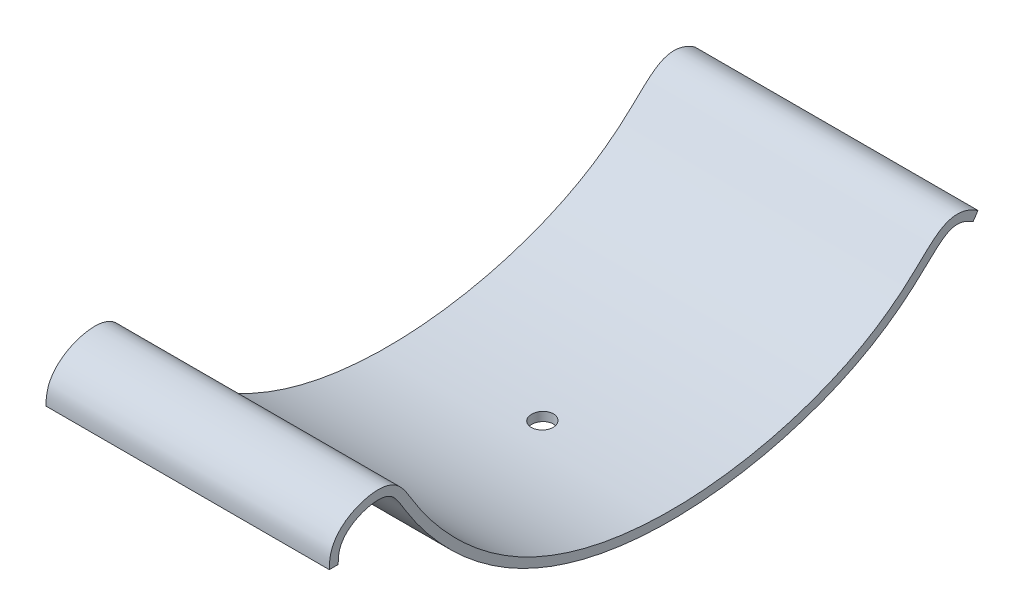
ISO-10303-21;
HEADER;
FILE_DESCRIPTION(('STEP AP214'),'2;1');
FILE_NAME('part.step','',(''),(''),'','','');
FILE_SCHEMA(('AUTOMOTIVE_DESIGN { 1 0 10303 214 1 1 1 1 }'));
ENDSEC;
DATA;
#1=APPLICATION_CONTEXT('core data for automotive mechanical design processes');
#2=APPLICATION_PROTOCOL_DEFINITION('international standard','automotive_design',2000,#1);
#3=PRODUCT_CONTEXT('',#1,'mechanical');
#4=PRODUCT('Part','Part','',(#3));
#5=PRODUCT_RELATED_PRODUCT_CATEGORY('part','',(#4));
#6=PRODUCT_DEFINITION_FORMATION('','',#4);
#7=PRODUCT_DEFINITION_CONTEXT('part definition',#1,'design');
#8=PRODUCT_DEFINITION('design','',#6,#7);
#9=PRODUCT_DEFINITION_SHAPE('','',#8);
#10=(LENGTH_UNIT() NAMED_UNIT(*) SI_UNIT(.MILLI.,.METRE.));
#11=(NAMED_UNIT(*) PLANE_ANGLE_UNIT() SI_UNIT($,.RADIAN.));
#12=(NAMED_UNIT(*) SI_UNIT($,.STERADIAN.) SOLID_ANGLE_UNIT());
#13=UNCERTAINTY_MEASURE_WITH_UNIT(LENGTH_MEASURE(1.E-05),#10,'distance_accuracy_value','');
#14=(GEOMETRIC_REPRESENTATION_CONTEXT(3) GLOBAL_UNCERTAINTY_ASSIGNED_CONTEXT((#13)) GLOBAL_UNIT_ASSIGNED_CONTEXT((#10,
#11,#12)) REPRESENTATION_CONTEXT('',''));
#15=CARTESIAN_POINT('',(0.,0.,0.));
#16=DIRECTION('',(0.,0.,1.));
#17=DIRECTION('',(1.,0.,0.));
#18=AXIS2_PLACEMENT_3D('',#15,#16,#17);
#19=CARTESIAN_POINT('',(-8.12799999999991,-0.834595862935661,-16.8716748113434));
#20=CARTESIAN_POINT('',(-8.12799999999991,-0.758500589889466,-16.7580385047832));
#21=CARTESIAN_POINT('',(-8.12799999999991,-0.614751083082066,-16.5100905502787));
#22=CARTESIAN_POINT('',(-8.12799999999991,-0.442822428426415,-16.0655195392353));
#23=CARTESIAN_POINT('',(-8.12799999999991,-0.390397203187676,-15.5351535365327));
#24=CARTESIAN_POINT('',(-8.12799999999991,-0.554381657714154,-14.9803618686963));
#25=CARTESIAN_POINT('',(-8.12799999999991,-0.959441699435293,-14.3394333059973));
#26=CARTESIAN_POINT('',(-8.12799999999991,-1.67781893043695,-13.5970485310267));
#27=CARTESIAN_POINT('',(-8.12799999999991,-2.69571342949548,-12.5111875307591));
#28=CARTESIAN_POINT('',(-8.12799999999991,-3.7571934363767,-11.0885539642779));
#29=CARTESIAN_POINT('',(-8.12799999999991,-5.10380533286114,-8.69093617801675));
#30=CARTESIAN_POINT('',(-8.12799999999991,-6.44967803214258,-4.84446903375801));
#31=CARTESIAN_POINT('',(-8.12799999999991,-7.09712226295534,0.254465303981544));
#32=CARTESIAN_POINT('',(-8.12799999999991,-6.69212017931453,4.91482262236442));
#33=CARTESIAN_POINT('',(-8.12799999999991,-5.44716621101371,8.6493730974796));
#34=CARTESIAN_POINT('',(-8.12799999999991,-3.73997250168423,11.4025743436018));
#35=CARTESIAN_POINT('',(-8.12799999999991,-1.95910220557749,13.3454415391405));
#36=CARTESIAN_POINT('',(-8.12799999999991,-0.394174789257407,14.6617063996737));
#37=CARTESIAN_POINT('',(-8.12799999999991,0.82661653105176,15.4883777575322));
#38=CARTESIAN_POINT('',(-8.12799999999991,1.73488163903246,15.998453090879));
#39=CARTESIAN_POINT('',(-8.12799999999991,2.45716276657815,16.6950338077725));
#40=CARTESIAN_POINT('',(-8.12799999999991,2.56249825223986,17.7825668359178));
#41=CARTESIAN_POINT('',(-8.12799999999991,2.23981894539993,18.8546539022874));
#42=CARTESIAN_POINT('',(-8.12799999999991,1.76507882125421,19.6532639018205));
#43=CARTESIAN_POINT('',(-8.12799999999991,1.1225727640134,20.153134502105));
#44=CARTESIAN_POINT('',(-8.12799999999991,0.474617449153558,20.3339100819827));
#45=CARTESIAN_POINT('',(-8.12799999999991,0.104773323174379,20.3536529968454));
#46=CARTESIAN_POINT('',(-8.12799999999991,-0.0750645134373062,20.3536529968454));
#47=B_SPLINE_CURVE_WITH_KNOTS('',3,(#19,#20,#21,#22,#23,#24,#25,#26,#27,#28,#29,#30,#31,#32,#33,
#34,#35,#36,#37,#38,#39,#40,#41,#42,#43,#44,#45,#46),.UNSPECIFIED.,.F.,.F.,(4,1,1,1,1,1,1,1,1,1,
1,1,1,1,1,1,1,1,1,1,1,1,1,1,1,4),(0.,0.0078125,0.015625,0.03125,0.046875,0.0625,0.09375,0.125,
0.15625,0.1875,0.25,0.3125,0.375,0.4375,0.5,0.5625,0.625,0.6875,0.75,0.8125,0.875,0.90625,
0.9375,0.96875,0.984375,1.),.UNSPECIFIED.);
#48=DIRECTION('',(1.,0.,0.));
#49=VECTOR('',#48,1.);
#50=SURFACE_OF_LINEAR_EXTRUSION('',#47,#49);
#51=CARTESIAN_POINT('',(0.,-6.92847417412679,0.635000000000052));
#52=CARTESIAN_POINT('',(0.0356673955473135,-6.92847424202453,0.634998423076402));
#53=CARTESIAN_POINT('',(0.0713604720865015,-6.92845990671786,0.631984826605673));
#54=CARTESIAN_POINT('',(0.141763460239447,-6.92839594212717,0.620004867662485));
#55=CARTESIAN_POINT('',(0.176472144631064,-6.92834627064212,0.611031388318102));
#56=CARTESIAN_POINT('',(0.243872049270245,-6.92819224238232,0.587388721582166));
#57=CARTESIAN_POINT('',(0.276564477052722,-6.92808791870129,0.572722982434909));
#58=CARTESIAN_POINT('',(0.339022647828301,-6.92779573587765,0.538111159860263));
#59=CARTESIAN_POINT('',(0.368788336539328,-6.92760787518604,0.518164978522118));
#60=CARTESIAN_POINT('',(0.424546285111496,-6.92711459438814,0.473560879821487));
#61=CARTESIAN_POINT('',(0.450538829234214,-6.92680918314421,0.448903317730044));
#62=CARTESIAN_POINT('',(0.498015900252995,-6.92604704787024,0.395575175288319));
#63=CARTESIAN_POINT('',(0.51950025788984,-6.92559031816063,0.36690444433153));
#64=CARTESIAN_POINT('',(0.557347808584863,-6.92449797108329,0.306369825006207));
#65=CARTESIAN_POINT('',(0.573711663882018,-6.92386237686846,0.274506350262276));
#66=CARTESIAN_POINT('',(0.600858658959247,-6.92239597643936,0.208489050026963));
#67=CARTESIAN_POINT('',(0.611641812346982,-6.92156517070108,0.174335230120456));
#68=CARTESIAN_POINT('',(0.627324297263235,-6.91970811583442,0.104704156437458));
#69=CARTESIAN_POINT('',(0.632223054050812,-6.91868184762616,0.0692267737347756));
#70=CARTESIAN_POINT('',(0.635998583786188,-6.91645292411601,-0.00204137857994751));
#71=CARTESIAN_POINT('',(0.634875346032915,-6.91525026850068,-0.0378321487487643));
#72=CARTESIAN_POINT('',(0.626638850884173,-6.91270560516999,-0.108735008090587));
#73=CARTESIAN_POINT('',(0.619521893871454,-6.91136351183547,-0.143846664384965));
#74=CARTESIAN_POINT('',(0.599496791261863,-6.90859580131977,-0.212374398013284));
#75=CARTESIAN_POINT('',(0.586588604606498,-6.90717018354648,-0.245790463324002));
#76=CARTESIAN_POINT('',(0.555334161688508,-6.904303148228,-0.310008418186525));
#77=CARTESIAN_POINT('',(0.536983389762097,-6.90286171852393,-0.340808109550972));
#78=CARTESIAN_POINT('',(0.495367209555368,-6.90004190433413,-0.398889288098149));
#79=CARTESIAN_POINT('',(0.472101792041757,-6.89866351996684,-0.426170768670957));
#80=CARTESIAN_POINT('',(0.421311155199238,-6.89604967252442,-0.476443936349189));
#81=CARTESIAN_POINT('',(0.393785424767783,-6.8948142266285,-0.499435108022604));
#82=CARTESIAN_POINT('',(0.33525570499369,-6.89256214336128,-0.54046826783324));
#83=CARTESIAN_POINT('',(0.304251735754644,-6.89154550472542,-0.558510284573607));
#84=CARTESIAN_POINT('',(0.239681090473667,-6.88979669326471,-0.589112075821943));
#85=CARTESIAN_POINT('',(0.206117255471266,-6.88906421041542,-0.601677826995722));
#86=CARTESIAN_POINT('',(0.137350924811729,-6.88792988320232,-0.620995313763373));
#87=CARTESIAN_POINT('',(0.102148445470637,-6.8875280355471,-0.627747107233996));
#88=CARTESIAN_POINT('',(0.0311620047851718,-6.88708191632692,-0.635236790847839));
#89=CARTESIAN_POINT('',(-0.00462098098345198,-6.88703709680061,-0.635983896909881));
#90=CARTESIAN_POINT('',(-0.0758040227018798,-6.88730656392684,-0.631467016846669));
#91=CARTESIAN_POINT('',(-0.111204080377829,-6.88762084895994,-0.626203057829213));
#92=CARTESIAN_POINT('',(-0.180596624576626,-6.88858746026657,-0.609819736844883));
#93=CARTESIAN_POINT('',(-0.214589873864755,-6.88923960069302,-0.598703593985635));
#94=CARTESIAN_POINT('',(-0.280227200436439,-6.89083927621305,-0.570935693564246));
#95=CARTESIAN_POINT('',(-0.311871266378478,-6.89178681273264,-0.554283909278961));
#96=CARTESIAN_POINT('',(-0.371946165725079,-6.89391793922611,-0.515900056570388));
#97=CARTESIAN_POINT('',(-0.400373835650002,-6.89510175848685,-0.49416304993474));
#98=CARTESIAN_POINT('',(-0.453178595006078,-6.89763187084351,-0.446234870161672));
#99=CARTESIAN_POINT('',(-0.477555645586833,-6.89897816549755,-0.420043654307806));
#100=CARTESIAN_POINT('',(-0.521606594144856,-6.90175632460805,-0.363904572105874));
#101=CARTESIAN_POINT('',(-0.541273149844062,-6.90318831835806,-0.33395095062288));
#102=CARTESIAN_POINT('',(-0.575298349175829,-6.90605719571663,-0.27116729201783));
#103=CARTESIAN_POINT('',(-0.58965697224162,-6.90749407934412,-0.238337243751027));
#104=CARTESIAN_POINT('',(-0.612667801579727,-6.91030204438403,-0.170704488766405));
#105=CARTESIAN_POINT('',(-0.621315740736801,-6.911673075883,-0.135900327997958));
#106=CARTESIAN_POINT('',(-0.632640699295836,-6.91428882480283,-0.0653290100735757));
#107=CARTESIAN_POINT('',(-0.635317720547508,-6.91553354226283,-0.029561853215968));
#108=CARTESIAN_POINT('',(-0.634622308853049,-6.91785344018537,0.0419037318404204));
#109=CARTESIAN_POINT('',(-0.631252489652438,-6.91892869368016,0.0776021830604811));
#110=CARTESIAN_POINT('',(-0.618561484296612,-6.92088635677184,0.147930587333971));
#111=CARTESIAN_POINT('',(-0.609240314536405,-6.92176876689997,0.182560543330657));
#112=CARTESIAN_POINT('',(-0.584919728294015,-6.92333542338773,0.249737725189134));
#113=CARTESIAN_POINT('',(-0.569925029917916,-6.92401983357185,0.282286655412163));
#114=CARTESIAN_POINT('',(-0.534681946390063,-6.925204158099,0.344405795392998));
#115=CARTESIAN_POINT('',(-0.514433778826222,-6.92570408008106,0.373976128447786));
#116=CARTESIAN_POINT('',(-0.469268019385189,-6.92654453647727,0.429286451509596));
#117=CARTESIAN_POINT('',(-0.444352397834166,-6.92688513793582,0.455028049588669));
#118=CARTESIAN_POINT('',(-0.390552566877031,-6.92744000994333,0.501963956599953));
#119=CARTESIAN_POINT('',(-0.361668433678539,-6.92765428291775,0.523158352832401));
#120=CARTESIAN_POINT('',(-0.300736863990924,-6.92799107246805,0.560409468213653));
#121=CARTESIAN_POINT('',(-0.268687494004858,-6.9281135325624,0.576463021342038));
#122=CARTESIAN_POINT('',(-0.202373577452853,-6.92829716661543,0.602944233185814));
#123=CARTESIAN_POINT('',(-0.168111721731151,-6.92835841358136,0.613378586899887));
#124=CARTESIAN_POINT('',(-0.111361415648438,-6.92842605207504,0.625560357252526));
#125=CARTESIAN_POINT('',(-0.0892407896247952,-6.92844437843214,0.629095784370743));
#126=CARTESIAN_POINT('',(-0.0447501460820092,-6.92846841815675,0.633816100579437));
#127=CARTESIAN_POINT('',(-0.0223801285414712,-6.92847413152316,0.635000989468261));
#128=CARTESIAN_POINT('',(0.,-6.92847417412679,0.635000000000052));
#129=B_SPLINE_CURVE_WITH_KNOTS('',3,(#51,#52,#53,#54,#55,#56,#57,#58,#59,#60,#61,#62,#63,#64,
#65,#66,#67,#68,#69,#70,#71,#72,#73,#74,#75,#76,#77,#78,#79,#80,#81,#82,#83,#84,#85,#86,#87,#88,
#89,#90,#91,#92,#93,#94,#95,#96,#97,#98,#99,#100,#101,#102,#103,#104,#105,#106,#107,#108,#109,
#110,#111,#112,#113,#114,#115,#116,#117,#118,#119,#120,#121,#122,#123,#124,#125,#126,#127,#128),
.UNSPECIFIED.,.T.,.F.,(4,2,2,2,2,2,2,2,2,2,2,2,2,2,2,2,2,2,2,2,2,2,2,2,2,2,2,2,2,2,2,2,2,2,2,2,
2,2,4),(0.,0.106920525513031,0.213968958087242,0.320952644060378,0.427938313880106,
0.534915919414027,0.64189754068855,0.748865320213855,0.8558328389139,0.96281080449899,
1.0697889601838,1.17683319646638,1.28387819168007,1.39101225080462,1.49814651120693,
1.6052936343021,1.71244013813813,1.81946941019151,1.92649761677819,2.03336152638932,
2.14022495408355,2.24702966079371,2.35383488310789,2.46074425669873,2.56765465562219,
2.6747306275297,2.78180701432259,2.88896332005867,2.99611959259912,3.10322955802008,
3.21033922837166,3.31736002140076,3.42437638255562,3.53134766904865,3.63831690165123,
3.74535188579428,3.85225905929953,3.91934819947078,3.9864373453976),.UNSPECIFIED.);
#130=CARTESIAN_POINT('',(0.,-6.92847417412679,0.635000000000052));
#131=VERTEX_POINT('',#130);
#132=EDGE_CURVE('E121',#131,#131,#129,.T.);
#133=ORIENTED_EDGE('',*,*,#132,.F.);
#134=EDGE_LOOP('',(#133));
#135=FACE_BOUND('',#134,.T.);
#136=DIRECTION('',(1.,0.,0.));
#137=VECTOR('',#136,1.);
#138=CARTESIAN_POINT('',(-8.12799999999991,-0.0750645134373062,20.3536529968454));
#139=LINE('',#138,#137);
#140=CARTESIAN_POINT('',(-8.12799999999991,-0.0750645134373062,20.3536529968454));
#141=VERTEX_POINT('',#140);
#142=CARTESIAN_POINT('',(8.12799999999991,-0.0750645134373062,20.3536529968454));
#143=VERTEX_POINT('',#142);
#144=EDGE_CURVE('E100',#141,#143,#139,.T.);
#145=ORIENTED_EDGE('',*,*,#144,.T.);
#146=CARTESIAN_POINT('',(8.12799999999991,-0.834595862935661,-16.8716748113434));
#147=CARTESIAN_POINT('',(8.12799999999991,-0.758500589889466,-16.7580385047832));
#148=CARTESIAN_POINT('',(8.12799999999991,-0.614751083082066,-16.5100905502787));
#149=CARTESIAN_POINT('',(8.12799999999991,-0.442822428426415,-16.0655195392353));
#150=CARTESIAN_POINT('',(8.12799999999991,-0.390397203187676,-15.5351535365327));
#151=CARTESIAN_POINT('',(8.12799999999991,-0.554381657714154,-14.9803618686963));
#152=CARTESIAN_POINT('',(8.12799999999991,-0.959441699435293,-14.3394333059973));
#153=CARTESIAN_POINT('',(8.12799999999991,-1.67781893043695,-13.5970485310267));
#154=CARTESIAN_POINT('',(8.12799999999991,-2.69571342949548,-12.5111875307591));
#155=CARTESIAN_POINT('',(8.12799999999991,-3.7571934363767,-11.0885539642779));
#156=CARTESIAN_POINT('',(8.12799999999991,-5.10380533286114,-8.69093617801675));
#157=CARTESIAN_POINT('',(8.12799999999991,-6.44967803214258,-4.84446903375801));
#158=CARTESIAN_POINT('',(8.12799999999991,-7.09712226295534,0.254465303981544));
#159=CARTESIAN_POINT('',(8.12799999999991,-6.69212017931453,4.91482262236442));
#160=CARTESIAN_POINT('',(8.12799999999991,-5.44716621101371,8.6493730974796));
#161=CARTESIAN_POINT('',(8.12799999999991,-3.73997250168423,11.4025743436018));
#162=CARTESIAN_POINT('',(8.12799999999991,-1.95910220557749,13.3454415391405));
#163=CARTESIAN_POINT('',(8.12799999999991,-0.394174789257407,14.6617063996737));
#164=CARTESIAN_POINT('',(8.12799999999991,0.82661653105176,15.4883777575322));
#165=CARTESIAN_POINT('',(8.12799999999991,1.73488163903246,15.998453090879));
#166=CARTESIAN_POINT('',(8.12799999999991,2.45716276657815,16.6950338077725));
#167=CARTESIAN_POINT('',(8.12799999999991,2.56249825223986,17.7825668359178));
#168=CARTESIAN_POINT('',(8.12799999999991,2.23981894539993,18.8546539022874));
#169=CARTESIAN_POINT('',(8.12799999999991,1.76507882125421,19.6532639018205));
#170=CARTESIAN_POINT('',(8.12799999999991,1.1225727640134,20.153134502105));
#171=CARTESIAN_POINT('',(8.12799999999991,0.474617449153558,20.3339100819827));
#172=CARTESIAN_POINT('',(8.12799999999991,0.104773323174379,20.3536529968454));
#173=CARTESIAN_POINT('',(8.12799999999991,-0.0750645134373062,20.3536529968454));
#174=B_SPLINE_CURVE_WITH_KNOTS('',3,(#146,#147,#148,#149,#150,#151,#152,#153,#154,#155,#156,
#157,#158,#159,#160,#161,#162,#163,#164,#165,#166,#167,#168,#169,#170,#171,#172,#173),
.UNSPECIFIED.,.F.,.F.,(4,1,1,1,1,1,1,1,1,1,1,1,1,1,1,1,1,1,1,1,1,1,1,1,1,4),(0.,0.0078125,
0.015625,0.03125,0.046875,0.0625,0.09375,0.125,0.15625,0.1875,0.25,0.3125,0.375,0.4375,0.5,
0.5625,0.625,0.6875,0.75,0.8125,0.875,0.90625,0.9375,0.96875,0.984375,1.),.UNSPECIFIED.);
#175=CARTESIAN_POINT('',(8.12799999999991,-0.834595862935661,-16.8716748113434));
#176=VERTEX_POINT('',#175);
#177=EDGE_CURVE('E103',#176,#143,#174,.T.);
#178=ORIENTED_EDGE('',*,*,#177,.F.);
#179=DIRECTION('',(1.,0.,0.));
#180=VECTOR('',#179,1.);
#181=CARTESIAN_POINT('',(-8.12799999999991,-0.834595862935661,-16.8716748113434));
#182=LINE('',#181,#180);
#183=CARTESIAN_POINT('',(-8.12799999999991,-0.834595862935661,-16.8716748113434));
#184=VERTEX_POINT('',#183);
#185=EDGE_CURVE('E13',#184,#176,#182,.T.);
#186=ORIENTED_EDGE('',*,*,#185,.F.);
#187=EDGE_CURVE('E104',#184,#141,#47,.T.);
#188=ORIENTED_EDGE('',*,*,#187,.T.);
#189=EDGE_LOOP('',(#145,#178,#186,#188));
#190=FACE_BOUND('',#189,.T.);
#191=ADVANCED_FACE('F55',(#135,#190),#50,.T.);
#192=CARTESIAN_POINT('',(-8.12799999999991,-1.25669751245872,-16.5890191949657));
#193=DIRECTION('',(0.,-0.556408693657023,-0.830908758903699));
#194=DIRECTION('',(0.,0.830908758903699,-0.556408693657023));
#195=AXIS2_PLACEMENT_3D('',#192,#193,#194);
#196=PLANE('',#195);
#197=ORIENTED_EDGE('',*,*,#185,.T.);
#198=DIRECTION('',(0.,0.830908758903699,-0.556408693657023));
#199=VECTOR('',#198,1.);
#200=CARTESIAN_POINT('',(8.12799999999991,-1.25669751245872,-16.5890191949657));
#201=LINE('',#200,#199);
#202=CARTESIAN_POINT('',(8.12799999999991,-1.25669751245872,-16.5890191949657));
#203=VERTEX_POINT('',#202);
#204=EDGE_CURVE('E120',#203,#176,#201,.T.);
#205=ORIENTED_EDGE('',*,*,#204,.F.);
#206=DIRECTION('',(1.,0.,0.));
#207=VECTOR('',#206,1.);
#208=CARTESIAN_POINT('',(-8.12799999999991,-1.25669751245872,-16.5890191949657));
#209=LINE('',#208,#207);
#210=CARTESIAN_POINT('',(-8.12799999999991,-1.25669751245872,-16.5890191949657));
#211=VERTEX_POINT('',#210);
#212=EDGE_CURVE('E70',#211,#203,#209,.T.);
#213=ORIENTED_EDGE('',*,*,#212,.F.);
#214=DIRECTION('',(0.,0.830908758903699,-0.556408693657023));
#215=VECTOR('',#214,1.);
#216=CARTESIAN_POINT('',(-8.12799999999991,-1.25669751245872,-16.5890191949657));
#217=LINE('',#216,#215);
#218=EDGE_CURVE('E109',#211,#184,#217,.T.);
#219=ORIENTED_EDGE('',*,*,#218,.T.);
#220=EDGE_LOOP('',(#197,#205,#213,#219));
#221=FACE_BOUND('',#220,.T.);
#222=ADVANCED_FACE('F161',(#221),#196,.T.);
#223=CARTESIAN_POINT('',(-8.12799999999991,-0.0750645134373062,19.8456529968454));
#224=CARTESIAN_POINT('',(-8.12799999999991,0.0778301212238652,19.8456529968454));
#225=CARTESIAN_POINT('',(-8.12799999999991,0.405127673048122,19.8271729007947));
#226=CARTESIAN_POINT('',(-8.12799999999991,0.879281159174905,19.6902710720697));
#227=CARTESIAN_POINT('',(-8.12799999999991,1.36452645229534,19.3217353070485));
#228=CARTESIAN_POINT('',(-8.12799999999991,1.77061817082691,18.6507219164174));
#229=CARTESIAN_POINT('',(-8.12799999999991,2.04728251444508,17.717040392712));
#230=CARTESIAN_POINT('',(-8.12799999999991,1.94881535312708,16.9098241504062));
#231=CARTESIAN_POINT('',(-8.12799999999991,1.47983481819236,16.4534140475832));
#232=CARTESIAN_POINT('',(-8.12799999999991,0.560492217258735,15.917379729166));
#233=CARTESIAN_POINT('',(-8.12799999999991,-0.704210581464193,15.0665429553525));
#234=CARTESIAN_POINT('',(-8.12799999999991,-2.31158175132795,13.7127430471539));
#235=CARTESIAN_POINT('',(-8.12799999999991,-4.1469511972696,11.7117544687212));
#236=CARTESIAN_POINT('',(-8.12799999999991,-5.91305093659944,8.86359826457794));
#237=CARTESIAN_POINT('',(-8.12799999999991,-7.19542404272233,5.01215723980408));
#238=CARTESIAN_POINT('',(-8.12799999999991,-7.60864838300734,0.239508784072306));
#239=CARTESIAN_POINT('',(-8.12799999999991,-6.94733663098812,-4.95739009147722));
#240=CARTESIAN_POINT('',(-8.12799999999991,-5.30124674848653,-9.68400196845587));
#241=CARTESIAN_POINT('',(-8.12799999999991,-3.43669149050052,-12.4699982841006));
#242=CARTESIAN_POINT('',(-8.12799999999991,-2.03576103810665,-13.9551897291113));
#243=CARTESIAN_POINT('',(-8.12799999999991,-1.34265292722857,-14.6787920053277));
#244=CARTESIAN_POINT('',(-8.12799999999991,-1.01813501228076,-15.2043382552447));
#245=CARTESIAN_POINT('',(-8.12799999999991,-0.909597338166757,-15.583909243199));
#246=CARTESIAN_POINT('',(-8.12799999999991,-0.942711314550704,-15.9441425416236));
#247=CARTESIAN_POINT('',(-8.12799999999991,-1.07205244131536,-16.2849674733981));
#248=CARTESIAN_POINT('',(-8.12799999999991,-1.19364198072114,-16.4948556885084));
#249=CARTESIAN_POINT('',(-8.12799999999991,-1.25669751245872,-16.5890191949657));
#250=B_SPLINE_CURVE_WITH_KNOTS('',3,(#223,#224,#225,#226,#227,#228,#229,#230,#231,#232,#233,
#234,#235,#236,#237,#238,#239,#240,#241,#242,#243,#244,#245,#246,#247,#248,#249),.UNSPECIFIED.,
.F.,.F.,(4,1,1,1,1,1,1,1,1,1,1,1,1,1,1,1,1,1,1,1,1,1,1,1,4),(0.,0.015625,0.03125,0.0625,0.09375,
0.125,0.1875,0.25,0.3125,0.375,0.4375,0.5,0.5625,0.625,0.6875,0.75,0.8125,0.875,0.90625,0.9375,
0.953125,0.96875,0.984375,0.9921875,1.),.UNSPECIFIED.);
#251=DIRECTION('',(1.,0.,0.));
#252=VECTOR('',#251,1.);
#253=SURFACE_OF_LINEAR_EXTRUSION('',#250,#252);
#254=CARTESIAN_POINT('',(0.,-7.43649820657044,0.635000000000052));
#255=CARTESIAN_POINT('',(-0.0356674244547499,-7.43649827297458,0.634998422897253));
#256=CARTESIAN_POINT('',(-0.0713605370265964,-7.4364841514613,0.631984820983911));
#257=CARTESIAN_POINT('',(-0.141763602631587,-7.43642118579442,0.620004837991458));
#258=CARTESIAN_POINT('',(-0.176472328111993,-7.43637230011202,0.611031338149664));
#259=CARTESIAN_POINT('',(-0.243872303579989,-7.43622083611119,0.587388618196333));
#260=CARTESIAN_POINT('',(-0.276564761604613,-7.43611829029928,0.572722847767187));
#261=CARTESIAN_POINT('',(-0.339022993813796,-7.43583128193242,0.538110945105031));
#262=CARTESIAN_POINT('',(-0.368788713611524,-7.43564681785554,0.518164714772001));
#263=CARTESIAN_POINT('',(-0.424546783489221,-7.43516268494728,0.47356044325154));
#264=CARTESIAN_POINT('',(-0.450539410695511,-7.43486302458273,0.448902748420471));
#265=CARTESIAN_POINT('',(-0.498016640720292,-7.43411547695883,0.395574259748251));
#266=CARTESIAN_POINT('',(-0.519501073942303,-7.43366758412466,0.366903314997838));
#267=CARTESIAN_POINT('',(-0.557348842455697,-7.43259658313371,0.30636799552603));
#268=CARTESIAN_POINT('',(-0.573712815260752,-7.43197349680743,0.274504018999989));
#269=CARTESIAN_POINT('',(-0.600859918569205,-7.43053616568994,0.208485518094984));
#270=CARTESIAN_POINT('',(-0.611643062595811,-7.42972192136193,0.174330999266583));
#271=CARTESIAN_POINT('',(-0.627325287550811,-7.42790192652937,0.104698438869867));
#272=CARTESIAN_POINT('',(-0.632223814038021,-7.42689615799,0.069220272913848));
#273=CARTESIAN_POINT('',(-0.635998604160552,-7.42471172805539,-0.00204960983367481));
#274=CARTESIAN_POINT('',(-0.634874857975173,-7.4235330663782,-0.0378413271364008));
#275=CARTESIAN_POINT('',(-0.626637083141101,-7.42103913898535,-0.108745244107158));
#276=CARTESIAN_POINT('',(-0.619519505685858,-7.41972379274649,-0.143857028601064));
#277=CARTESIAN_POINT('',(-0.599493050842423,-7.41701116125498,-0.212385005733263));
#278=CARTESIAN_POINT('',(-0.586584133760928,-7.4156138754408,-0.245801186748299));
#279=CARTESIAN_POINT('',(-0.555328665133611,-7.4128037857387,-0.310018172868549));
#280=CARTESIAN_POINT('',(-0.536977776100706,-7.41139097034129,-0.340816866434142));
#281=CARTESIAN_POINT('',(-0.495361702494459,-7.40862706581108,-0.398896051483257));
#282=CARTESIAN_POINT('',(-0.472096509114394,-7.4072759767889,-0.4261765366618));
#283=CARTESIAN_POINT('',(-0.421306860530366,-7.40471384465228,-0.476447648213609));
#284=CARTESIAN_POINT('',(-0.393781912063342,-7.40350281778489,-0.499437777099378));
#285=CARTESIAN_POINT('',(-0.335254275527715,-7.40129521115228,-0.540469063527676));
#286=CARTESIAN_POINT('',(-0.3042516067488,-7.4002986301977,-0.55851024851834));
#287=CARTESIAN_POINT('',(-0.239682648793331,-7.39858425676519,-0.589111434380103));
#288=CARTESIAN_POINT('',(-0.206119088508979,-7.39786617235177,-0.60167717663046));
#289=CARTESIAN_POINT('',(-0.137353516615735,-7.39675413140777,-0.620994721112109));
#290=CARTESIAN_POINT('',(-0.10215152068901,-7.39636017177551,-0.627746578978519));
#291=CARTESIAN_POINT('',(-0.0311639954604372,-7.39592278295591,-0.635236784288622));
#292=CARTESIAN_POINT('',(0.0046205961838145,-7.39587883741053,-0.635983990105473));
#293=CARTESIAN_POINT('',(0.0758068618038791,-7.39614303318815,-0.63146676791305));
#294=CARTESIAN_POINT('',(0.111208537438593,-7.3964511729852,-0.62620236595831));
#295=CARTESIAN_POINT('',(0.180605045090388,-7.39739888945709,-0.609817388491417));
#296=CARTESIAN_POINT('',(0.214600610430282,-7.39803829095558,-0.598699908127951));
#297=CARTESIAN_POINT('',(0.280242329742719,-7.39960670321986,-0.570928436501706));
#298=CARTESIAN_POINT('',(0.311888472815823,-7.4005357153291,-0.554274419555792));
#299=CARTESIAN_POINT('',(0.371965909703713,-7.40262509949328,-0.515885935076823));
#300=CARTESIAN_POINT('',(0.400394161723405,-7.40378568763587,-0.494146719166258));
#301=CARTESIAN_POINT('',(0.453199621067018,-7.40626607835031,-0.446213665995757));
#302=CARTESIAN_POINT('',(0.477576790977147,-7.40758588239242,-0.420019787599281));
#303=CARTESIAN_POINT('',(0.521625976039104,-7.41030919979734,-0.363876782849274));
#304=CARTESIAN_POINT('',(0.541290933653865,-7.41171283483567,-0.333922124919537));
#305=CARTESIAN_POINT('',(0.575312782910401,-7.41452478951967,-0.271136665740483));
#306=CARTESIAN_POINT('',(0.589669655030436,-7.41593310918255,-0.23830585391398));
#307=CARTESIAN_POINT('',(0.612676512250511,-7.4186851086755,-0.170672989861908));
#308=CARTESIAN_POINT('',(0.621322400767943,-7.4200287414655,-0.135869542020544));
#309=CARTESIAN_POINT('',(0.632643604447019,-7.42259213738944,-0.0653001817583068));
#310=CARTESIAN_POINT('',(0.635318921007169,-7.42381190055239,-0.0295342695628766));
#311=CARTESIAN_POINT('',(0.634620594183734,-7.42608527066511,0.0419289450360111));
#312=CARTESIAN_POINT('',(0.631249465774206,-7.42713894649938,0.0776262697856581));
#313=CARTESIAN_POINT('',(0.618556285248541,-7.42905732089254,0.147952064082134));
#314=CARTESIAN_POINT('',(0.609234248349435,-7.42992201993465,0.182580536361882));
#315=CARTESIAN_POINT('',(0.584912049005864,-7.43145740550623,0.249755700035266));
#316=CARTESIAN_POINT('',(0.569916411897062,-7.43212824590964,0.282304026457581));
#317=CARTESIAN_POINT('',(0.534671666914588,-7.4332892396184,0.344421731870245));
#318=CARTESIAN_POINT('',(0.514422776175743,-7.43377940038983,0.373991233915415));
#319=CARTESIAN_POINT('',(0.469255391653302,-7.43460361058949,0.429300283706671));
#320=CARTESIAN_POINT('',(0.444338781788169,-7.43493772281045,0.45504136913091));
#321=CARTESIAN_POINT('',(0.39053707557711,-7.43548216617514,0.501976030291339));
#322=CARTESIAN_POINT('',(0.361652055481105,-7.43569249969678,0.523169693382681));
#323=CARTESIAN_POINT('',(0.300718860185758,-7.43602321265305,0.560419145275349));
#324=CARTESIAN_POINT('',(0.268668753481995,-7.43614353677034,0.576471771074116));
#325=CARTESIAN_POINT('',(0.202353530982242,-7.43632403877193,0.602950974431835));
#326=CARTESIAN_POINT('',(0.168091106625732,-7.43638428832611,0.613384249111013));
#327=CARTESIAN_POINT('',(0.11134368669841,-7.43645083869356,0.625563384490521));
#328=CARTESIAN_POINT('',(0.0892265341470029,-7.4364688759441,0.629097678652943));
#329=CARTESIAN_POINT('',(0.0447429579245494,-7.43649253905319,0.633816481214659));
#330=CARTESIAN_POINT('',(0.0223765342330278,-7.43649816491074,0.63500098942094));
#331=CARTESIAN_POINT('',(0.,-7.43649820657044,0.635000000000052));
#332=B_SPLINE_CURVE_WITH_KNOTS('',3,(#254,#255,#256,#257,#258,#259,#260,#261,#262,#263,#264,
#265,#266,#267,#268,#269,#270,#271,#272,#273,#274,#275,#276,#277,#278,#279,#280,#281,#282,#283,
#284,#285,#286,#287,#288,#289,#290,#291,#292,#293,#294,#295,#296,#297,#298,#299,#300,#301,#302,
#303,#304,#305,#306,#307,#308,#309,#310,#311,#312,#313,#314,#315,#316,#317,#318,#319,#320,#321,
#322,#323,#324,#325,#326,#327,#328,#329,#330,#331),.UNSPECIFIED.,.T.,.F.,(4,2,2,2,2,2,2,2,2,2,2,
2,2,2,2,2,2,2,2,2,2,2,2,2,2,2,2,2,2,2,2,2,2,2,2,2,2,2,4),(0.,0.106920624364053,
0.213969189626463,0.320952981369406,0.427938760789335,0.534916678331329,0.641898619619166,
0.748867236009135,0.855835593196482,0.962814028016204,1.06979263728888,1.17683463064959,
1.28387735767737,1.39100563275485,1.49813409981417,1.60527498122776,1.71241526839806,
1.81944293965011,1.92646958670512,2.03333831347816,2.14020657707985,2.24701838467745,
2.35383068776535,2.46074312934214,2.56765655825452,2.6747291256434,2.78180208681307,
2.88895177001503,2.99610142811895,3.10320652845025,3.21031135490484,3.31733093266904,
3.42434608765492,3.53131814339899,3.63828814404541,3.74532383168443,3.85223167075016,
3.91931004412172,3.98638842300311),.UNSPECIFIED.);
#333=CARTESIAN_POINT('',(0.,-7.43649820657044,0.635000000000052));
#334=VERTEX_POINT('',#333);
#335=EDGE_CURVE('E60',#334,#334,#332,.T.);
#336=ORIENTED_EDGE('',*,*,#335,.F.);
#337=EDGE_LOOP('',(#336));
#338=FACE_BOUND('',#337,.T.);
#339=ORIENTED_EDGE('',*,*,#212,.T.);
#340=CARTESIAN_POINT('',(8.12799999999991,-0.0750645134373062,19.8456529968454));
#341=CARTESIAN_POINT('',(8.12799999999991,0.0778301212238652,19.8456529968454));
#342=CARTESIAN_POINT('',(8.12799999999991,0.405127673048122,19.8271729007947));
#343=CARTESIAN_POINT('',(8.12799999999991,0.879281159174905,19.6902710720697));
#344=CARTESIAN_POINT('',(8.12799999999991,1.36452645229534,19.3217353070485));
#345=CARTESIAN_POINT('',(8.12799999999991,1.77061817082691,18.6507219164174));
#346=CARTESIAN_POINT('',(8.12799999999991,2.04728251444508,17.717040392712));
#347=CARTESIAN_POINT('',(8.12799999999991,1.94881535312708,16.9098241504062));
#348=CARTESIAN_POINT('',(8.12799999999991,1.47983481819236,16.4534140475832));
#349=CARTESIAN_POINT('',(8.12799999999991,0.560492217258735,15.917379729166));
#350=CARTESIAN_POINT('',(8.12799999999991,-0.704210581464193,15.0665429553525));
#351=CARTESIAN_POINT('',(8.12799999999991,-2.31158175132795,13.7127430471539));
#352=CARTESIAN_POINT('',(8.12799999999991,-4.1469511972696,11.7117544687212));
#353=CARTESIAN_POINT('',(8.12799999999991,-5.91305093659944,8.86359826457794));
#354=CARTESIAN_POINT('',(8.12799999999991,-7.19542404272233,5.01215723980408));
#355=CARTESIAN_POINT('',(8.12799999999991,-7.60864838300734,0.239508784072306));
#356=CARTESIAN_POINT('',(8.12799999999991,-6.94733663098812,-4.95739009147722));
#357=CARTESIAN_POINT('',(8.12799999999991,-5.30124674848653,-9.68400196845587));
#358=CARTESIAN_POINT('',(8.12799999999991,-3.43669149050052,-12.4699982841006));
#359=CARTESIAN_POINT('',(8.12799999999991,-2.03576103810665,-13.9551897291113));
#360=CARTESIAN_POINT('',(8.12799999999991,-1.34265292722857,-14.6787920053277));
#361=CARTESIAN_POINT('',(8.12799999999991,-1.01813501228076,-15.2043382552447));
#362=CARTESIAN_POINT('',(8.12799999999991,-0.909597338166757,-15.583909243199));
#363=CARTESIAN_POINT('',(8.12799999999991,-0.942711314550704,-15.9441425416236));
#364=CARTESIAN_POINT('',(8.12799999999991,-1.07205244131536,-16.2849674733981));
#365=CARTESIAN_POINT('',(8.12799999999991,-1.19364198072114,-16.4948556885084));
#366=CARTESIAN_POINT('',(8.12799999999991,-1.25669751245872,-16.5890191949657));
#367=B_SPLINE_CURVE_WITH_KNOTS('',3,(#340,#341,#342,#343,#344,#345,#346,#347,#348,#349,#350,
#351,#352,#353,#354,#355,#356,#357,#358,#359,#360,#361,#362,#363,#364,#365,#366),.UNSPECIFIED.,
.F.,.F.,(4,1,1,1,1,1,1,1,1,1,1,1,1,1,1,1,1,1,1,1,1,1,1,1,4),(0.,0.015625,0.03125,0.0625,0.09375,
0.125,0.1875,0.25,0.3125,0.375,0.4375,0.5,0.5625,0.625,0.6875,0.75,0.8125,0.875,0.90625,0.9375,
0.953125,0.96875,0.984375,0.9921875,1.),.UNSPECIFIED.);
#368=CARTESIAN_POINT('',(8.12799999999991,-0.0750645134373062,19.8456529968454));
#369=VERTEX_POINT('',#368);
#370=EDGE_CURVE('E116',#369,#203,#367,.T.);
#371=ORIENTED_EDGE('',*,*,#370,.F.);
#372=DIRECTION('',(1.,0.,0.));
#373=VECTOR('',#372,1.);
#374=CARTESIAN_POINT('',(-8.12799999999991,-0.0750645134373062,19.8456529968454));
#375=LINE('',#374,#373);
#376=CARTESIAN_POINT('',(-8.12799999999991,-0.0750645134373062,19.8456529968454));
#377=VERTEX_POINT('',#376);
#378=EDGE_CURVE('E108',#377,#369,#375,.T.);
#379=ORIENTED_EDGE('',*,*,#378,.F.);
#380=EDGE_CURVE('E149',#377,#211,#250,.T.);
#381=ORIENTED_EDGE('',*,*,#380,.T.);
#382=EDGE_LOOP('',(#339,#371,#379,#381));
#383=FACE_BOUND('',#382,.T.);
#384=ADVANCED_FACE('F157',(#338,#383),#253,.T.);
#385=CARTESIAN_POINT('',(-8.12799999999991,-0.0750645134373062,20.3536529968454));
#386=DIRECTION('',(0.,-1.,0.));
#387=DIRECTION('',(0.,0.,-1.));
#388=AXIS2_PLACEMENT_3D('',#385,#386,#387);
#389=PLANE('',#388);
#390=ORIENTED_EDGE('',*,*,#378,.T.);
#391=DIRECTION('',(0.,0.,-1.));
#392=VECTOR('',#391,1.);
#393=CARTESIAN_POINT('',(8.12799999999991,-0.0750645134373062,20.3536529968454));
#394=LINE('',#393,#392);
#395=EDGE_CURVE('E111',#143,#369,#394,.T.);
#396=ORIENTED_EDGE('',*,*,#395,.F.);
#397=ORIENTED_EDGE('',*,*,#144,.F.);
#398=DIRECTION('',(0.,0.,-1.));
#399=VECTOR('',#398,1.);
#400=CARTESIAN_POINT('',(-8.12799999999991,-0.0750645134373062,20.3536529968454));
#401=LINE('',#400,#399);
#402=EDGE_CURVE('E144',#141,#377,#401,.T.);
#403=ORIENTED_EDGE('',*,*,#402,.T.);
#404=EDGE_LOOP('',(#390,#396,#397,#403));
#405=FACE_BOUND('',#404,.T.);
#406=ADVANCED_FACE('F112',(#405),#389,.T.);
#407=CARTESIAN_POINT('',(-8.12799999999991,-3.72769307055476,11.2675186685046));
#408=DIRECTION('',(-1.,0.,0.));
#409=DIRECTION('',(0.,0.,1.));
#410=AXIS2_PLACEMENT_3D('',#407,#408,#409);
#411=PLANE('',#410);
#412=ORIENTED_EDGE('',*,*,#187,.F.);
#413=ORIENTED_EDGE('',*,*,#218,.F.);
#414=ORIENTED_EDGE('',*,*,#380,.F.);
#415=ORIENTED_EDGE('',*,*,#402,.F.);
#416=EDGE_LOOP('',(#412,#413,#414,#415));
#417=FACE_BOUND('',#416,.T.);
#418=ADVANCED_FACE('F165',(#417),#411,.T.);
#419=CARTESIAN_POINT('',(8.12799999999991,-3.72769307055476,11.2675186685046));
#420=DIRECTION('',(-1.,0.,0.));
#421=DIRECTION('',(0.,0.,1.));
#422=AXIS2_PLACEMENT_3D('',#419,#420,#421);
#423=PLANE('',#422);
#424=ORIENTED_EDGE('',*,*,#177,.T.);
#425=ORIENTED_EDGE('',*,*,#395,.T.);
#426=ORIENTED_EDGE('',*,*,#370,.T.);
#427=ORIENTED_EDGE('',*,*,#204,.T.);
#428=EDGE_LOOP('',(#424,#425,#426,#427));
#429=FACE_BOUND('',#428,.T.);
#430=ADVANCED_FACE('F119',(#429),#423,.F.);
#431=CARTESIAN_POINT('',(0.,-7.60864838300734,0.));
#432=DIRECTION('',(0.,1.,0.));
#433=DIRECTION('',(0.,0.,1.));
#434=AXIS2_PLACEMENT_3D('',#431,#432,#433);
#435=CYLINDRICAL_SURFACE('',#434,0.635);
#436=ORIENTED_EDGE('',*,*,#132,.T.);
#437=EDGE_LOOP('',(#436));
#438=FACE_BOUND('',#437,.T.);
#439=ORIENTED_EDGE('',*,*,#335,.T.);
#440=EDGE_LOOP('',(#439));
#441=FACE_BOUND('',#440,.T.);
#442=ADVANCED_FACE('F179',(#438,#441),#435,.F.);
#443=CLOSED_SHELL('',(#191,#222,#384,#406,#418,#430,#442));
#444=MANIFOLD_SOLID_BREP('B2',#443);
#445=ADVANCED_BREP_SHAPE_REPRESENTATION('',(#18,#444),#14);
#446=SHAPE_DEFINITION_REPRESENTATION(#9,#445);
ENDSEC;
END-ISO-10303-21;
